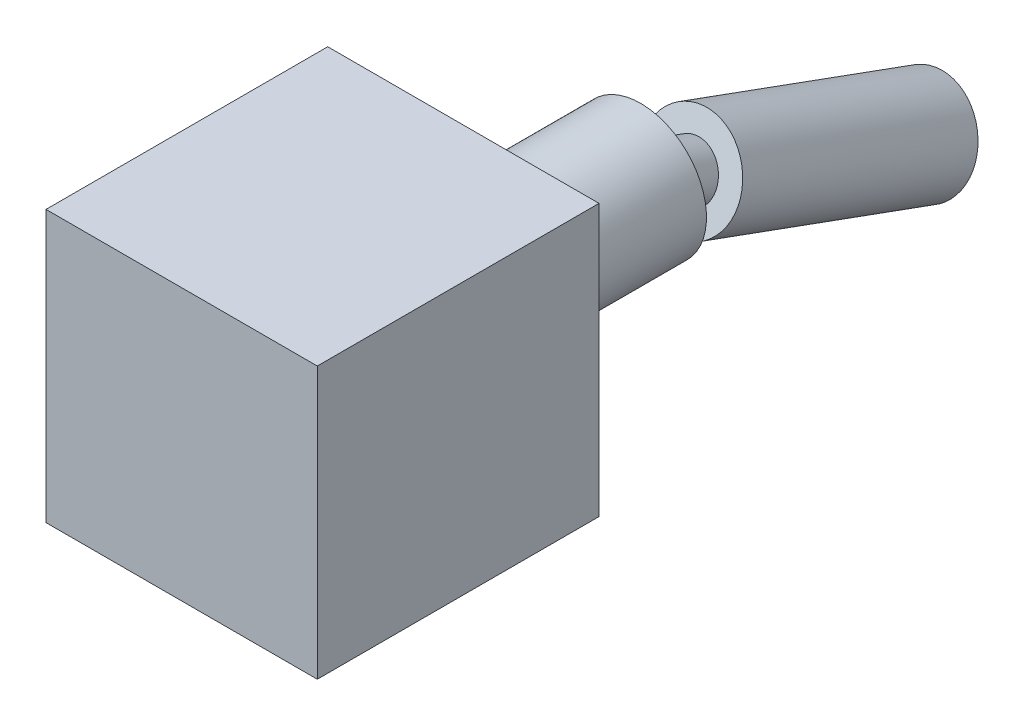
ISO-10303-21;
HEADER;
FILE_DESCRIPTION(('STEP AP214'),'2;1');
FILE_NAME('part.step','',(''),(''),'','','');
FILE_SCHEMA(('AUTOMOTIVE_DESIGN { 1 0 10303 214 1 1 1 1 }'));
ENDSEC;
DATA;
#1=APPLICATION_CONTEXT('core data for automotive mechanical design processes');
#2=APPLICATION_PROTOCOL_DEFINITION('international standard','automotive_design',2000,#1);
#3=PRODUCT_CONTEXT('',#1,'mechanical');
#4=PRODUCT('Part','Part','',(#3));
#5=PRODUCT_RELATED_PRODUCT_CATEGORY('part','',(#4));
#6=PRODUCT_DEFINITION_FORMATION('','',#4);
#7=PRODUCT_DEFINITION_CONTEXT('part definition',#1,'design');
#8=PRODUCT_DEFINITION('design','',#6,#7);
#9=PRODUCT_DEFINITION_SHAPE('','',#8);
#10=(LENGTH_UNIT() NAMED_UNIT(*) SI_UNIT(.MILLI.,.METRE.));
#11=(NAMED_UNIT(*) PLANE_ANGLE_UNIT() SI_UNIT($,.RADIAN.));
#12=(NAMED_UNIT(*) SI_UNIT($,.STERADIAN.) SOLID_ANGLE_UNIT());
#13=UNCERTAINTY_MEASURE_WITH_UNIT(LENGTH_MEASURE(1.E-05),#10,'distance_accuracy_value','');
#14=(GEOMETRIC_REPRESENTATION_CONTEXT(3) GLOBAL_UNCERTAINTY_ASSIGNED_CONTEXT((#13)) GLOBAL_UNIT_ASSIGNED_CONTEXT((#10,
#11,#12)) REPRESENTATION_CONTEXT('',''));
#15=CARTESIAN_POINT('',(0.,0.,0.));
#16=DIRECTION('',(0.,0.,1.));
#17=DIRECTION('',(1.,0.,0.));
#18=AXIS2_PLACEMENT_3D('',#15,#16,#17);
#19=CARTESIAN_POINT('',(6.5,13.,6.75));
#20=DIRECTION('',(-1.,0.,0.));
#21=DIRECTION('',(0.,0.,1.));
#22=AXIS2_PLACEMENT_3D('',#19,#20,#21);
#23=PLANE('',#22);
#24=DIRECTION('',(0.,0.,-1.));
#25=VECTOR('',#24,1.);
#26=CARTESIAN_POINT('',(6.5,0.,6.75));
#27=LINE('',#26,#25);
#28=CARTESIAN_POINT('',(6.5,0.,6.75));
#29=VERTEX_POINT('',#28);
#30=CARTESIAN_POINT('',(6.5,0.,-6.75));
#31=VERTEX_POINT('',#30);
#32=EDGE_CURVE('E103',#29,#31,#27,.T.);
#33=ORIENTED_EDGE('',*,*,#32,.T.);
#34=DIRECTION('',(0.,-1.,0.));
#35=VECTOR('',#34,1.);
#36=CARTESIAN_POINT('',(6.5,13.,-6.75));
#37=LINE('',#36,#35);
#38=CARTESIAN_POINT('',(6.5,13.,-6.75));
#39=VERTEX_POINT('',#38);
#40=EDGE_CURVE('E94',#39,#31,#37,.T.);
#41=ORIENTED_EDGE('',*,*,#40,.F.);
#42=DIRECTION('',(0.,0.,-1.));
#43=VECTOR('',#42,1.);
#44=CARTESIAN_POINT('',(6.5,13.,6.75));
#45=LINE('',#44,#43);
#46=CARTESIAN_POINT('',(6.5,13.,6.75));
#47=VERTEX_POINT('',#46);
#48=EDGE_CURVE('E88',#47,#39,#45,.T.);
#49=ORIENTED_EDGE('',*,*,#48,.F.);
#50=DIRECTION('',(0.,-1.,0.));
#51=VECTOR('',#50,1.);
#52=CARTESIAN_POINT('',(6.5,13.,6.75));
#53=LINE('',#52,#51);
#54=EDGE_CURVE('E99',#47,#29,#53,.T.);
#55=ORIENTED_EDGE('',*,*,#54,.T.);
#56=EDGE_LOOP('',(#33,#41,#49,#55));
#57=FACE_BOUND('',#56,.T.);
#58=ADVANCED_FACE('F35',(#57),#23,.F.);
#59=CARTESIAN_POINT('',(-6.5,13.,-6.75));
#60=DIRECTION('',(0.,0.,1.));
#61=DIRECTION('',(1.,0.,0.));
#62=AXIS2_PLACEMENT_3D('',#59,#60,#61);
#63=PLANE('',#62);
#64=CARTESIAN_POINT('',(0.,6.5,-6.75));
#65=DIRECTION('',(0.,0.,1.));
#66=DIRECTION('',(1.,0.,0.));
#67=AXIS2_PLACEMENT_3D('',#64,#65,#66);
#68=CIRCLE('',#67,4.);
#69=CARTESIAN_POINT('',(4.,6.5,-6.75));
#70=VERTEX_POINT('',#69);
#71=EDGE_CURVE('E113',#70,#70,#68,.F.);
#72=ORIENTED_EDGE('',*,*,#71,.F.);
#73=EDGE_LOOP('',(#72));
#74=FACE_BOUND('',#73,.T.);
#75=DIRECTION('',(-1.,0.,0.));
#76=VECTOR('',#75,1.);
#77=CARTESIAN_POINT('',(-6.5,0.,-6.75));
#78=LINE('',#77,#76);
#79=CARTESIAN_POINT('',(-6.5,0.,-6.75));
#80=VERTEX_POINT('',#79);
#81=EDGE_CURVE('E93',#31,#80,#78,.T.);
#82=ORIENTED_EDGE('',*,*,#81,.T.);
#83=DIRECTION('',(0.,-1.,0.));
#84=VECTOR('',#83,1.);
#85=CARTESIAN_POINT('',(-6.5,13.,-6.75));
#86=LINE('',#85,#84);
#87=CARTESIAN_POINT('',(-6.5,13.,-6.75));
#88=VERTEX_POINT('',#87);
#89=EDGE_CURVE('E91',#88,#80,#86,.T.);
#90=ORIENTED_EDGE('',*,*,#89,.F.);
#91=DIRECTION('',(-1.,0.,0.));
#92=VECTOR('',#91,1.);
#93=CARTESIAN_POINT('',(-6.5,13.,-6.75));
#94=LINE('',#93,#92);
#95=EDGE_CURVE('E83',#39,#88,#94,.T.);
#96=ORIENTED_EDGE('',*,*,#95,.F.);
#97=ORIENTED_EDGE('',*,*,#40,.T.);
#98=EDGE_LOOP('',(#82,#90,#96,#97));
#99=FACE_BOUND('',#98,.T.);
#100=ADVANCED_FACE('F92',(#74,#99),#63,.F.);
#101=CARTESIAN_POINT('',(-6.5,13.,6.75));
#102=DIRECTION('',(1.,0.,0.));
#103=DIRECTION('',(0.,0.,-1.));
#104=AXIS2_PLACEMENT_3D('',#101,#102,#103);
#105=PLANE('',#104);
#106=DIRECTION('',(0.,0.,1.));
#107=VECTOR('',#106,1.);
#108=CARTESIAN_POINT('',(-6.5,0.,6.75));
#109=LINE('',#108,#107);
#110=CARTESIAN_POINT('',(-6.5,0.,6.75));
#111=VERTEX_POINT('',#110);
#112=EDGE_CURVE('E69',#80,#111,#109,.T.);
#113=ORIENTED_EDGE('',*,*,#112,.T.);
#114=DIRECTION('',(0.,-1.,0.));
#115=VECTOR('',#114,1.);
#116=CARTESIAN_POINT('',(-6.5,13.,6.75));
#117=LINE('',#116,#115);
#118=CARTESIAN_POINT('',(-6.5,13.,6.75));
#119=VERTEX_POINT('',#118);
#120=EDGE_CURVE('E95',#119,#111,#117,.T.);
#121=ORIENTED_EDGE('',*,*,#120,.F.);
#122=DIRECTION('',(0.,0.,1.));
#123=VECTOR('',#122,1.);
#124=CARTESIAN_POINT('',(-6.5,13.,6.75));
#125=LINE('',#124,#123);
#126=EDGE_CURVE('E86',#88,#119,#125,.T.);
#127=ORIENTED_EDGE('',*,*,#126,.F.);
#128=ORIENTED_EDGE('',*,*,#89,.T.);
#129=EDGE_LOOP('',(#113,#121,#127,#128));
#130=FACE_BOUND('',#129,.T.);
#131=ADVANCED_FACE('F97',(#130),#105,.F.);
#132=CARTESIAN_POINT('',(-6.5,13.,6.75));
#133=DIRECTION('',(0.,0.,-1.));
#134=DIRECTION('',(-1.,0.,0.));
#135=AXIS2_PLACEMENT_3D('',#132,#133,#134);
#136=PLANE('',#135);
#137=DIRECTION('',(1.,0.,0.));
#138=VECTOR('',#137,1.);
#139=CARTESIAN_POINT('',(-6.5,0.,6.75));
#140=LINE('',#139,#138);
#141=EDGE_CURVE('E75',#111,#29,#140,.T.);
#142=ORIENTED_EDGE('',*,*,#141,.T.);
#143=ORIENTED_EDGE('',*,*,#54,.F.);
#144=DIRECTION('',(1.,0.,0.));
#145=VECTOR('',#144,1.);
#146=CARTESIAN_POINT('',(-6.5,13.,6.75));
#147=LINE('',#146,#145);
#148=EDGE_CURVE('E52',#119,#47,#147,.T.);
#149=ORIENTED_EDGE('',*,*,#148,.F.);
#150=ORIENTED_EDGE('',*,*,#120,.T.);
#151=EDGE_LOOP('',(#142,#143,#149,#150));
#152=FACE_BOUND('',#151,.T.);
#153=ADVANCED_FACE('F148',(#152),#136,.F.);
#154=CARTESIAN_POINT('',(0.,13.,0.));
#155=DIRECTION('',(0.,-1.,0.));
#156=DIRECTION('',(0.,0.,-1.));
#157=AXIS2_PLACEMENT_3D('',#154,#155,#156);
#158=PLANE('',#157);
#159=ORIENTED_EDGE('',*,*,#48,.T.);
#160=ORIENTED_EDGE('',*,*,#95,.T.);
#161=ORIENTED_EDGE('',*,*,#126,.T.);
#162=ORIENTED_EDGE('',*,*,#148,.T.);
#163=EDGE_LOOP('',(#159,#160,#161,#162));
#164=FACE_BOUND('',#163,.T.);
#165=ADVANCED_FACE('F84',(#164),#158,.F.);
#166=CARTESIAN_POINT('',(0.,0.,0.));
#167=DIRECTION('',(0.,-1.,0.));
#168=DIRECTION('',(0.,0.,-1.));
#169=AXIS2_PLACEMENT_3D('',#166,#167,#168);
#170=PLANE('',#169);
#171=ORIENTED_EDGE('',*,*,#32,.F.);
#172=ORIENTED_EDGE('',*,*,#141,.F.);
#173=ORIENTED_EDGE('',*,*,#112,.F.);
#174=ORIENTED_EDGE('',*,*,#81,.F.);
#175=EDGE_LOOP('',(#171,#172,#173,#174));
#176=FACE_BOUND('',#175,.T.);
#177=ADVANCED_FACE('F151',(#176),#170,.T.);
#178=CARTESIAN_POINT('',(0.,6.5,-7.75));
#179=DIRECTION('',(0.,0.,1.));
#180=DIRECTION('',(1.,0.,0.));
#181=AXIS2_PLACEMENT_3D('',#178,#179,#180);
#182=CYLINDRICAL_SURFACE('',#181,4.);
#183=CARTESIAN_POINT('',(0.,6.5,-7.75));
#184=DIRECTION('',(0.,0.,-1.));
#185=DIRECTION('',(-1.,0.,0.));
#186=AXIS2_PLACEMENT_3D('',#183,#184,#185);
#187=CIRCLE('',#186,4.);
#188=CARTESIAN_POINT('',(-4.,6.5,-7.75));
#189=VERTEX_POINT('',#188);
#190=EDGE_CURVE('E117',#189,#189,#187,.T.);
#191=ORIENTED_EDGE('',*,*,#190,.F.);
#192=EDGE_LOOP('',(#191));
#193=FACE_BOUND('',#192,.T.);
#194=ORIENTED_EDGE('',*,*,#71,.T.);
#195=EDGE_LOOP('',(#194));
#196=FACE_BOUND('',#195,.T.);
#197=ADVANCED_FACE('F154',(#193,#196),#182,.T.);
#198=CARTESIAN_POINT('',(0.,6.5,-7.75));
#199=DIRECTION('',(0.,0.,-1.));
#200=DIRECTION('',(-1.,0.,0.));
#201=AXIS2_PLACEMENT_3D('',#198,#199,#200);
#202=PLANE('',#201);
#203=CARTESIAN_POINT('',(0.,6.5,-7.75));
#204=DIRECTION('',(0.,0.,-1.));
#205=DIRECTION('',(-1.,0.,0.));
#206=AXIS2_PLACEMENT_3D('',#203,#204,#205);
#207=CIRCLE('',#206,3.15);
#208=CARTESIAN_POINT('',(-3.15,6.5,-7.75));
#209=VERTEX_POINT('',#208);
#210=EDGE_CURVE('E114',#209,#209,#207,.T.);
#211=ORIENTED_EDGE('',*,*,#210,.F.);
#212=EDGE_LOOP('',(#211));
#213=FACE_BOUND('',#212,.T.);
#214=ORIENTED_EDGE('',*,*,#190,.T.);
#215=EDGE_LOOP('',(#214));
#216=FACE_BOUND('',#215,.T.);
#217=ADVANCED_FACE('F166',(#213,#216),#202,.T.);
#218=CARTESIAN_POINT('',(0.,6.5,-15.25));
#219=DIRECTION('',(0.,0.,-1.));
#220=DIRECTION('',(-1.,0.,0.));
#221=AXIS2_PLACEMENT_3D('',#218,#219,#220);
#222=PLANE('',#221);
#223=CARTESIAN_POINT('',(0.,6.5,-15.25));
#224=DIRECTION('',(0.,0.,-1.));
#225=DIRECTION('',(0.,1.,0.));
#226=AXIS2_PLACEMENT_3D('',#223,#224,#225);
#227=ELLIPSE('',#226,1.38343110421869,1.3);
#228=CARTESIAN_POINT('',(0.,7.88343110421868,-15.25));
#229=VERTEX_POINT('',#228);
#230=EDGE_CURVE('E120',#229,#229,#227,.T.);
#231=ORIENTED_EDGE('',*,*,#230,.F.);
#232=EDGE_LOOP('',(#231));
#233=FACE_BOUND('',#232,.T.);
#234=CARTESIAN_POINT('',(0.,6.5,-15.25));
#235=DIRECTION('',(0.,0.,-1.));
#236=DIRECTION('',(-1.,0.,0.));
#237=AXIS2_PLACEMENT_3D('',#234,#235,#236);
#238=CIRCLE('',#237,3.15);
#239=CARTESIAN_POINT('',(-3.15,6.5,-15.25));
#240=VERTEX_POINT('',#239);
#241=EDGE_CURVE('E106',#240,#240,#238,.T.);
#242=ORIENTED_EDGE('',*,*,#241,.T.);
#243=EDGE_LOOP('',(#242));
#244=FACE_BOUND('',#243,.T.);
#245=ADVANCED_FACE('F162',(#233,#244),#222,.T.);
#246=CARTESIAN_POINT('',(0.,6.5,-15.25));
#247=DIRECTION('',(0.,0.,1.));
#248=DIRECTION('',(1.,0.,0.));
#249=AXIS2_PLACEMENT_3D('',#246,#247,#248);
#250=CYLINDRICAL_SURFACE('',#249,3.15);
#251=ORIENTED_EDGE('',*,*,#210,.T.);
#252=EDGE_LOOP('',(#251));
#253=FACE_BOUND('',#252,.T.);
#254=ORIENTED_EDGE('',*,*,#241,.F.);
#255=EDGE_LOOP('',(#254));
#256=FACE_BOUND('',#255,.T.);
#257=ADVANCED_FACE('F158',(#253,#256),#250,.T.);
#258=CARTESIAN_POINT('',(0.,6.5,-15.25));
#259=DIRECTION('',(0.,0.342020143325669,0.939692620785908));
#260=DIRECTION('',(0.,-0.939692620785908,0.342020143325669));
#261=AXIS2_PLACEMENT_3D('',#258,#259,#260);
#262=CYLINDRICAL_SURFACE('',#261,1.3);
#263=ORIENTED_EDGE('',*,*,#230,.T.);
#264=EDGE_LOOP('',(#263));
#265=FACE_BOUND('',#264,.T.);
#266=CARTESIAN_POINT('',(0.,5.64494964168583,-17.5992315519648));
#267=DIRECTION('',(0.,0.342020143325669,0.939692620785908));
#268=DIRECTION('',(0.,-0.939692620785908,0.342020143325669));
#269=AXIS2_PLACEMENT_3D('',#266,#267,#268);
#270=CIRCLE('',#269,1.3);
#271=CARTESIAN_POINT('',(0.,4.42334923466415,-17.1546053656414));
#272=VERTEX_POINT('',#271);
#273=EDGE_CURVE('E194',#272,#272,#270,.T.);
#274=ORIENTED_EDGE('',*,*,#273,.T.);
#275=EDGE_LOOP('',(#274));
#276=FACE_BOUND('',#275,.T.);
#277=ADVANCED_FACE('F161',(#265,#276),#262,.T.);
#278=CARTESIAN_POINT('',(0.,4.42334923466415,-17.1546053656414));
#279=DIRECTION('',(0.,0.342020143325669,0.939692620785908));
#280=DIRECTION('',(0.,-0.939692620785908,0.342020143325669));
#281=AXIS2_PLACEMENT_3D('',#278,#279,#280);
#282=PLANE('',#281);
#283=CARTESIAN_POINT('',(0.,5.64494964168583,-17.5992315519648));
#284=DIRECTION('',(0.,0.342020143325669,0.939692620785908));
#285=DIRECTION('',(0.,-0.939692620785908,0.342020143325669));
#286=AXIS2_PLACEMENT_3D('',#283,#284,#285);
#287=CIRCLE('',#286,2.4);
#288=CARTESIAN_POINT('',(0.,3.38968735179965,-16.7783832079832));
#289=VERTEX_POINT('',#288);
#290=EDGE_CURVE('E191',#289,#289,#287,.T.);
#291=ORIENTED_EDGE('',*,*,#290,.T.);
#292=EDGE_LOOP('',(#291));
#293=FACE_BOUND('',#292,.T.);
#294=ORIENTED_EDGE('',*,*,#273,.F.);
#295=EDGE_LOOP('',(#294));
#296=FACE_BOUND('',#295,.T.);
#297=ADVANCED_FACE('F176',(#293,#296),#282,.T.);
#298=CARTESIAN_POINT('',(0.,6.5,-15.25));
#299=DIRECTION('',(0.,0.342020143325669,0.939692620785908));
#300=DIRECTION('',(0.,-0.939692620785908,0.342020143325669));
#301=AXIS2_PLACEMENT_3D('',#298,#299,#300);
#302=CYLINDRICAL_SURFACE('',#301,2.4);
#303=CARTESIAN_POINT('',(0.,1.54070792177779,-28.8755430013957));
#304=DIRECTION('',(0.,-0.342020143325671,-0.939692620785907));
#305=DIRECTION('',(0.,0.939692620785907,-0.342020143325671));
#306=AXIS2_PLACEMENT_3D('',#303,#304,#305);
#307=CIRCLE('',#306,2.4);
#308=CARTESIAN_POINT('',(0.,3.79597021166397,-29.6963913453773));
#309=VERTEX_POINT('',#308);
#310=EDGE_CURVE('E44',#309,#309,#307,.F.);
#311=ORIENTED_EDGE('',*,*,#310,.T.);
#312=EDGE_LOOP('',(#311));
#313=FACE_BOUND('',#312,.T.);
#314=ORIENTED_EDGE('',*,*,#290,.F.);
#315=EDGE_LOOP('',(#314));
#316=FACE_BOUND('',#315,.T.);
#317=ADVANCED_FACE('F125',(#313,#316),#302,.T.);
#318=CARTESIAN_POINT('',(0.,-0.782958396773516,-28.2426331815712));
#319=DIRECTION('',(0.,-0.342020143325669,-0.939692620785908));
#320=DIRECTION('',(0.,0.939692620785908,-0.342020143325669));
#321=AXIS2_PLACEMENT_3D('',#318,#319,#320);
#322=PLANE('',#321);
#323=CARTESIAN_POINT('',(0.,1.47230389311266,-29.0634815255529));
#324=DIRECTION('',(0.,-0.342020143325669,-0.939692620785908));
#325=DIRECTION('',(0.,0.939692620785908,-0.342020143325669));
#326=AXIS2_PLACEMENT_3D('',#323,#324,#325);
#327=CIRCLE('',#326,2.19999999999998);
#328=CARTESIAN_POINT('',(0.,3.53962765884163,-29.8159258408693));
#329=VERTEX_POINT('',#328);
#330=EDGE_CURVE('E11',#329,#329,#327,.T.);
#331=ORIENTED_EDGE('',*,*,#330,.T.);
#332=EDGE_LOOP('',(#331));
#333=FACE_BOUND('',#332,.T.);
#334=CARTESIAN_POINT('',(0.,1.47230389311266,-29.0634815255528));
#335=DIRECTION('',(0.,0.342020143325669,0.939692620785908));
#336=DIRECTION('',(0.,-0.939692620785908,0.342020143325669));
#337=AXIS2_PLACEMENT_3D('',#334,#335,#336);
#338=CIRCLE('',#337,1.25);
#339=CARTESIAN_POINT('',(0.,0.297688117130277,-28.6359563463958));
#340=VERTEX_POINT('',#339);
#341=EDGE_CURVE('E190',#340,#340,#338,.T.);
#342=ORIENTED_EDGE('',*,*,#341,.T.);
#343=EDGE_LOOP('',(#342));
#344=FACE_BOUND('',#343,.T.);
#345=ADVANCED_FACE('F134',(#333,#344),#322,.T.);
#346=CARTESIAN_POINT('',(0.,1.75589201465137,-28.2843295651997));
#347=DIRECTION('',(0.,0.342020143325669,0.939692620785908));
#348=DIRECTION('',(0.,-0.939692620785908,0.342020143325669));
#349=AXIS2_PLACEMENT_3D('',#346,#347,#348);
#350=SPHERICAL_SURFACE('',#349,1.5);
#351=ORIENTED_EDGE('',*,*,#341,.F.);
#352=EDGE_LOOP('',(#351));
#353=FACE_BOUND('',#352,.T.);
#354=ADVANCED_FACE('F129',(#353),#350,.T.);
#355=CARTESIAN_POINT('',(0.,1.54070792177779,-28.8755430013957));
#356=DIRECTION('',(0.,0.342020143325671,0.939692620785907));
#357=DIRECTION('',(0.,-0.939692620785907,0.342020143325671));
#358=AXIS2_PLACEMENT_3D('',#355,#356,#357);
#359=CONICAL_SURFACE('',#358,2.4,0.785398163397466);
#360=ORIENTED_EDGE('',*,*,#330,.F.);
#361=EDGE_LOOP('',(#360));
#362=FACE_BOUND('',#361,.T.);
#363=ORIENTED_EDGE('',*,*,#310,.F.);
#364=EDGE_LOOP('',(#363));
#365=FACE_BOUND('',#364,.T.);
#366=ADVANCED_FACE('F37',(#362,#365),#359,.T.);
#367=CLOSED_SHELL('',(#58,#100,#131,#153,#165,#177,#197,#217,#245,#257,#277,#297,#317,#345,#354,#366));
#368=MANIFOLD_SOLID_BREP('B2',#367);
#369=ADVANCED_BREP_SHAPE_REPRESENTATION('',(#18,#368),#14);
#370=SHAPE_DEFINITION_REPRESENTATION(#9,#369);
ENDSEC;
END-ISO-10303-21;
